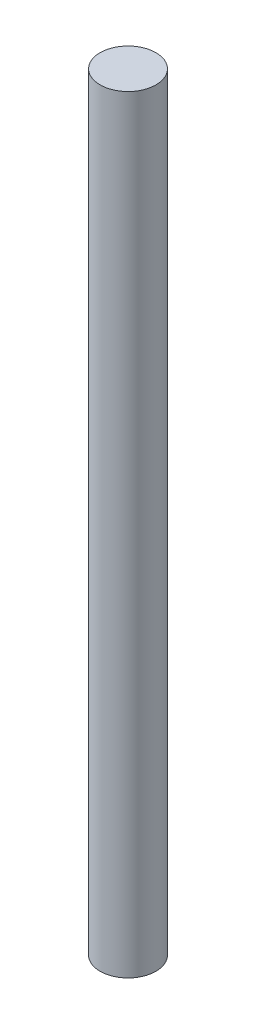
ISO-10303-21;
HEADER;
FILE_DESCRIPTION(('STEP AP214'),'2;1');
FILE_NAME('part.step','',(''),(''),'','','');
FILE_SCHEMA(('AUTOMOTIVE_DESIGN { 1 0 10303 214 1 1 1 1 }'));
ENDSEC;
DATA;
#1=APPLICATION_CONTEXT('core data for automotive mechanical design processes');
#2=APPLICATION_PROTOCOL_DEFINITION('international standard','automotive_design',2000,#1);
#3=PRODUCT_CONTEXT('',#1,'mechanical');
#4=PRODUCT('Part','Part','',(#3));
#5=PRODUCT_RELATED_PRODUCT_CATEGORY('part','',(#4));
#6=PRODUCT_DEFINITION_FORMATION('','',#4);
#7=PRODUCT_DEFINITION_CONTEXT('part definition',#1,'design');
#8=PRODUCT_DEFINITION('design','',#6,#7);
#9=PRODUCT_DEFINITION_SHAPE('','',#8);
#10=(LENGTH_UNIT() NAMED_UNIT(*) SI_UNIT(.MILLI.,.METRE.));
#11=(NAMED_UNIT(*) PLANE_ANGLE_UNIT() SI_UNIT($,.RADIAN.));
#12=(NAMED_UNIT(*) SI_UNIT($,.STERADIAN.) SOLID_ANGLE_UNIT());
#13=UNCERTAINTY_MEASURE_WITH_UNIT(LENGTH_MEASURE(1.E-05),#10,'distance_accuracy_value','');
#14=(GEOMETRIC_REPRESENTATION_CONTEXT(3) GLOBAL_UNCERTAINTY_ASSIGNED_CONTEXT((#13)) GLOBAL_UNIT_ASSIGNED_CONTEXT((#10,
#11,#12)) REPRESENTATION_CONTEXT('',''));
#15=CARTESIAN_POINT('',(0.,0.,0.));
#16=DIRECTION('',(0.,0.,1.));
#17=DIRECTION('',(1.,0.,0.));
#18=AXIS2_PLACEMENT_3D('',#15,#16,#17);
#19=CARTESIAN_POINT('',(-21.,95.,18.));
#20=DIRECTION('',(0.,-1.,0.));
#21=DIRECTION('',(0.,0.,-1.));
#22=AXIS2_PLACEMENT_3D('',#19,#20,#21);
#23=CYLINDRICAL_SURFACE('',#22,6.);
#24=CARTESIAN_POINT('',(-21.,190.,18.));
#25=DIRECTION('',(0.,-1.,0.));
#26=DIRECTION('',(0.,0.,-1.));
#27=AXIS2_PLACEMENT_3D('',#24,#25,#26);
#28=CIRCLE('',#27,6.);
#29=CARTESIAN_POINT('',(-21.,190.,12.));
#30=VERTEX_POINT('',#29);
#31=EDGE_CURVE('E10',#30,#30,#28,.T.);
#32=ORIENTED_EDGE('',*,*,#31,.T.);
#33=EDGE_LOOP('',(#32));
#34=FACE_BOUND('',#33,.T.);
#35=CARTESIAN_POINT('',(-21.,25.,18.));
#36=DIRECTION('',(0.,-1.,0.));
#37=DIRECTION('',(0.,0.,-1.));
#38=AXIS2_PLACEMENT_3D('',#35,#36,#37);
#39=CIRCLE('',#38,6.);
#40=CARTESIAN_POINT('',(-21.,25.,12.));
#41=VERTEX_POINT('',#40);
#42=EDGE_CURVE('E41',#41,#41,#39,.T.);
#43=ORIENTED_EDGE('',*,*,#42,.F.);
#44=EDGE_LOOP('',(#43));
#45=FACE_BOUND('',#44,.T.);
#46=ADVANCED_FACE('F34',(#34,#45),#23,.T.);
#47=CARTESIAN_POINT('',(-21.,190.,18.));
#48=DIRECTION('',(0.,1.,0.));
#49=DIRECTION('',(0.,0.,1.));
#50=AXIS2_PLACEMENT_3D('',#47,#48,#49);
#51=PLANE('',#50);
#52=ORIENTED_EDGE('',*,*,#31,.F.);
#53=EDGE_LOOP('',(#52));
#54=FACE_BOUND('',#53,.T.);
#55=ADVANCED_FACE('F36',(#54),#51,.T.);
#56=CARTESIAN_POINT('',(-21.,25.,18.));
#57=DIRECTION('',(0.,-1.,0.));
#58=DIRECTION('',(0.,0.,-1.));
#59=AXIS2_PLACEMENT_3D('',#56,#57,#58);
#60=PLANE('',#59);
#61=ORIENTED_EDGE('',*,*,#42,.T.);
#62=EDGE_LOOP('',(#61));
#63=FACE_BOUND('',#62,.T.);
#64=ADVANCED_FACE('F47',(#63),#60,.T.);
#65=CLOSED_SHELL('',(#46,#55,#64));
#66=MANIFOLD_SOLID_BREP('B2',#65);
#67=ADVANCED_BREP_SHAPE_REPRESENTATION('',(#18,#66),#14);
#68=SHAPE_DEFINITION_REPRESENTATION(#9,#67);
ENDSEC;
END-ISO-10303-21;
